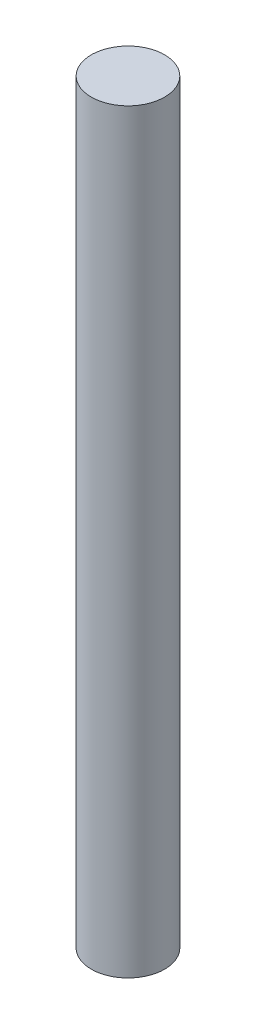
ISO-10303-21;
HEADER;
FILE_DESCRIPTION(('STEP AP214'),'2;1');
FILE_NAME('part.step','',(''),(''),'','','');
FILE_SCHEMA(('AUTOMOTIVE_DESIGN { 1 0 10303 214 1 1 1 1 }'));
ENDSEC;
DATA;
#1=APPLICATION_CONTEXT('core data for automotive mechanical design processes');
#2=APPLICATION_PROTOCOL_DEFINITION('international standard','automotive_design',2000,#1);
#3=PRODUCT_CONTEXT('',#1,'mechanical');
#4=PRODUCT('Part','Part','',(#3));
#5=PRODUCT_RELATED_PRODUCT_CATEGORY('part','',(#4));
#6=PRODUCT_DEFINITION_FORMATION('','',#4);
#7=PRODUCT_DEFINITION_CONTEXT('part definition',#1,'design');
#8=PRODUCT_DEFINITION('design','',#6,#7);
#9=PRODUCT_DEFINITION_SHAPE('','',#8);
#10=(LENGTH_UNIT() NAMED_UNIT(*) SI_UNIT(.MILLI.,.METRE.));
#11=(NAMED_UNIT(*) PLANE_ANGLE_UNIT() SI_UNIT($,.RADIAN.));
#12=(NAMED_UNIT(*) SI_UNIT($,.STERADIAN.) SOLID_ANGLE_UNIT());
#13=UNCERTAINTY_MEASURE_WITH_UNIT(LENGTH_MEASURE(1.E-05),#10,'distance_accuracy_value','');
#14=(GEOMETRIC_REPRESENTATION_CONTEXT(3) GLOBAL_UNCERTAINTY_ASSIGNED_CONTEXT((#13)) GLOBAL_UNIT_ASSIGNED_CONTEXT((#10,
#11,#12)) REPRESENTATION_CONTEXT('',''));
#15=CARTESIAN_POINT('',(0.,0.,0.));
#16=DIRECTION('',(0.,0.,1.));
#17=DIRECTION('',(1.,0.,0.));
#18=AXIS2_PLACEMENT_3D('',#15,#16,#17);
#19=CARTESIAN_POINT('',(0.,309.,0.));
#20=DIRECTION('',(0.,-1.,0.));
#21=DIRECTION('',(0.,0.,-1.));
#22=AXIS2_PLACEMENT_3D('',#19,#20,#21);
#23=CYLINDRICAL_SURFACE('',#22,15.);
#24=CARTESIAN_POINT('',(0.,309.,0.));
#25=DIRECTION('',(0.,1.,0.));
#26=DIRECTION('',(0.,0.,1.));
#27=AXIS2_PLACEMENT_3D('',#24,#25,#26);
#28=CIRCLE('',#27,15.);
#29=CARTESIAN_POINT('',(0.,309.,15.));
#30=VERTEX_POINT('',#29);
#31=EDGE_CURVE('E10',#30,#30,#28,.T.);
#32=ORIENTED_EDGE('',*,*,#31,.F.);
#33=EDGE_LOOP('',(#32));
#34=FACE_BOUND('',#33,.T.);
#35=CARTESIAN_POINT('',(0.,0.,0.));
#36=DIRECTION('',(0.,1.,0.));
#37=DIRECTION('',(0.,0.,1.));
#38=AXIS2_PLACEMENT_3D('',#35,#36,#37);
#39=CIRCLE('',#38,15.);
#40=CARTESIAN_POINT('',(0.,0.,15.));
#41=VERTEX_POINT('',#40);
#42=EDGE_CURVE('E40',#41,#41,#39,.T.);
#43=ORIENTED_EDGE('',*,*,#42,.T.);
#44=EDGE_LOOP('',(#43));
#45=FACE_BOUND('',#44,.T.);
#46=ADVANCED_FACE('F37',(#34,#45),#23,.T.);
#47=CARTESIAN_POINT('',(0.,309.,0.));
#48=DIRECTION('',(0.,1.,0.));
#49=DIRECTION('',(0.,0.,1.));
#50=AXIS2_PLACEMENT_3D('',#47,#48,#49);
#51=PLANE('',#50);
#52=ORIENTED_EDGE('',*,*,#31,.T.);
#53=EDGE_LOOP('',(#52));
#54=FACE_BOUND('',#53,.T.);
#55=ADVANCED_FACE('F52',(#54),#51,.T.);
#56=CARTESIAN_POINT('',(0.,0.,0.));
#57=DIRECTION('',(0.,1.,0.));
#58=DIRECTION('',(0.,0.,1.));
#59=AXIS2_PLACEMENT_3D('',#56,#57,#58);
#60=PLANE('',#59);
#61=ORIENTED_EDGE('',*,*,#42,.F.);
#62=EDGE_LOOP('',(#61));
#63=FACE_BOUND('',#62,.T.);
#64=ADVANCED_FACE('F50',(#63),#60,.F.);
#65=CLOSED_SHELL('',(#46,#55,#64));
#66=MANIFOLD_SOLID_BREP('B2',#65);
#67=ADVANCED_BREP_SHAPE_REPRESENTATION('',(#18,#66),#14);
#68=SHAPE_DEFINITION_REPRESENTATION(#9,#67);
ENDSEC;
END-ISO-10303-21;
